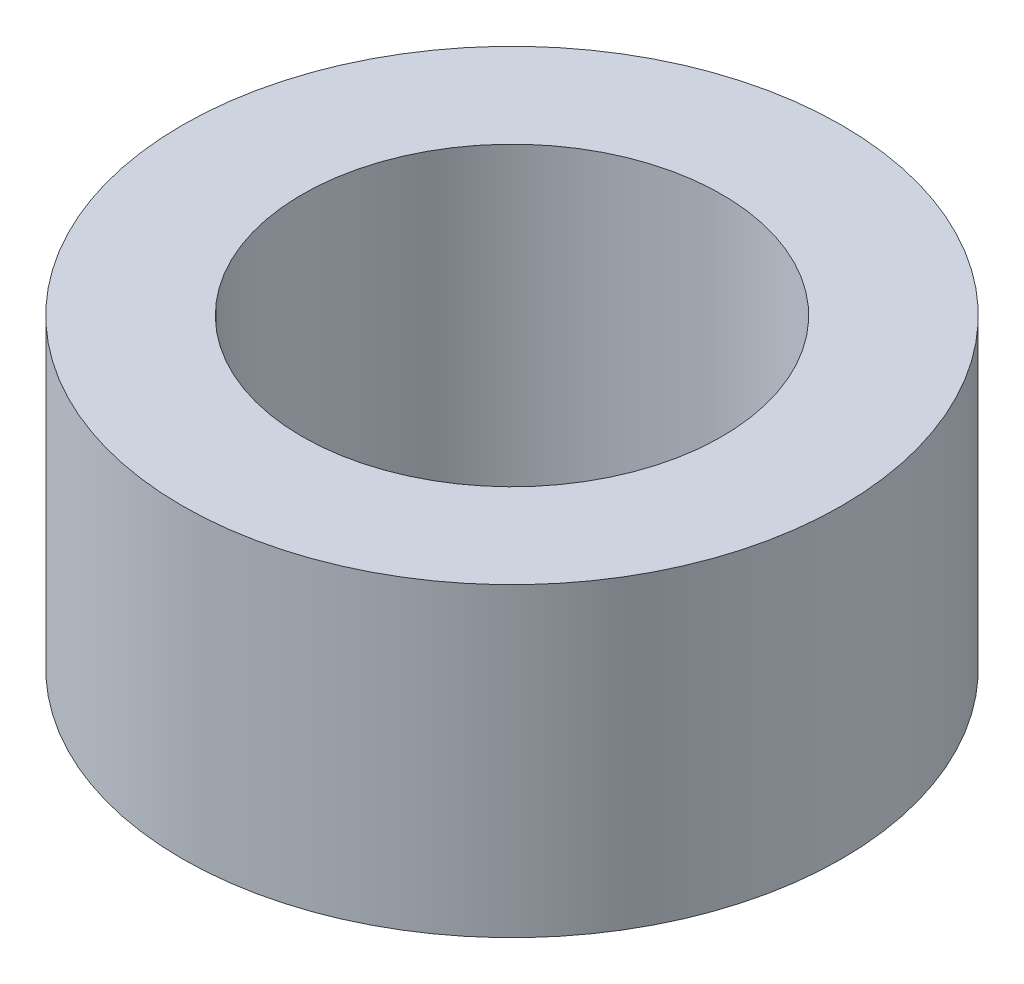
ISO-10303-21;
HEADER;
FILE_DESCRIPTION(('STEP AP214'),'2;1');
FILE_NAME('part.step','',(''),(''),'','','');
FILE_SCHEMA(('AUTOMOTIVE_DESIGN { 1 0 10303 214 1 1 1 1 }'));
ENDSEC;
DATA;
#1=APPLICATION_CONTEXT('core data for automotive mechanical design processes');
#2=APPLICATION_PROTOCOL_DEFINITION('international standard','automotive_design',2000,#1);
#3=PRODUCT_CONTEXT('',#1,'mechanical');
#4=PRODUCT('Part','Part','',(#3));
#5=PRODUCT_RELATED_PRODUCT_CATEGORY('part','',(#4));
#6=PRODUCT_DEFINITION_FORMATION('','',#4);
#7=PRODUCT_DEFINITION_CONTEXT('part definition',#1,'design');
#8=PRODUCT_DEFINITION('design','',#6,#7);
#9=PRODUCT_DEFINITION_SHAPE('','',#8);
#10=(LENGTH_UNIT() NAMED_UNIT(*) SI_UNIT(.MILLI.,.METRE.));
#11=(NAMED_UNIT(*) PLANE_ANGLE_UNIT() SI_UNIT($,.RADIAN.));
#12=(NAMED_UNIT(*) SI_UNIT($,.STERADIAN.) SOLID_ANGLE_UNIT());
#13=UNCERTAINTY_MEASURE_WITH_UNIT(LENGTH_MEASURE(1.E-05),#10,'distance_accuracy_value','');
#14=(GEOMETRIC_REPRESENTATION_CONTEXT(3) GLOBAL_UNCERTAINTY_ASSIGNED_CONTEXT((#13)) GLOBAL_UNIT_ASSIGNED_CONTEXT((#10,
#11,#12)) REPRESENTATION_CONTEXT('',''));
#15=CARTESIAN_POINT('',(0.,0.,0.));
#16=DIRECTION('',(0.,0.,1.));
#17=DIRECTION('',(1.,0.,0.));
#18=AXIS2_PLACEMENT_3D('',#15,#16,#17);
#19=CARTESIAN_POINT('',(0.,5.1,0.));
#20=DIRECTION('',(0.,1.,0.));
#21=DIRECTION('',(0.,0.,1.));
#22=AXIS2_PLACEMENT_3D('',#19,#20,#21);
#23=PLANE('',#22);
#24=CARTESIAN_POINT('',(0.,5.1,0.));
#25=DIRECTION('',(0.,1.,0.));
#26=DIRECTION('',(0.,0.,1.));
#27=AXIS2_PLACEMENT_3D('',#24,#25,#26);
#28=CIRCLE('',#27,5.5);
#29=CARTESIAN_POINT('',(0.,5.1,5.5));
#30=VERTEX_POINT('',#29);
#31=EDGE_CURVE('E10',#30,#30,#28,.T.);
#32=ORIENTED_EDGE('',*,*,#31,.T.);
#33=EDGE_LOOP('',(#32));
#34=FACE_BOUND('',#33,.T.);
#35=CARTESIAN_POINT('',(0.,5.1,0.));
#36=DIRECTION('',(0.,1.,0.));
#37=DIRECTION('',(0.,0.,1.));
#38=AXIS2_PLACEMENT_3D('',#35,#36,#37);
#39=CIRCLE('',#38,3.5);
#40=CARTESIAN_POINT('',(0.,5.1,3.5));
#41=VERTEX_POINT('',#40);
#42=EDGE_CURVE('E60',#41,#41,#39,.T.);
#43=ORIENTED_EDGE('',*,*,#42,.F.);
#44=EDGE_LOOP('',(#43));
#45=FACE_BOUND('',#44,.T.);
#46=ADVANCED_FACE('F45',(#34,#45),#23,.T.);
#47=CARTESIAN_POINT('',(0.,0.,0.));
#48=DIRECTION('',(0.,1.,0.));
#49=DIRECTION('',(0.,0.,1.));
#50=AXIS2_PLACEMENT_3D('',#47,#48,#49);
#51=PLANE('',#50);
#52=CARTESIAN_POINT('',(0.,0.,0.));
#53=DIRECTION('',(0.,1.,0.));
#54=DIRECTION('',(0.,0.,1.));
#55=AXIS2_PLACEMENT_3D('',#52,#53,#54);
#56=CIRCLE('',#55,5.5);
#57=CARTESIAN_POINT('',(0.,0.,5.5));
#58=VERTEX_POINT('',#57);
#59=EDGE_CURVE('E49',#58,#58,#56,.T.);
#60=ORIENTED_EDGE('',*,*,#59,.F.);
#61=EDGE_LOOP('',(#60));
#62=FACE_BOUND('',#61,.T.);
#63=CARTESIAN_POINT('',(0.,0.,0.));
#64=DIRECTION('',(0.,1.,0.));
#65=DIRECTION('',(0.,0.,1.));
#66=AXIS2_PLACEMENT_3D('',#63,#64,#65);
#67=CIRCLE('',#66,3.5);
#68=CARTESIAN_POINT('',(0.,0.,3.5));
#69=VERTEX_POINT('',#68);
#70=EDGE_CURVE('E62',#69,#69,#67,.T.);
#71=ORIENTED_EDGE('',*,*,#70,.T.);
#72=EDGE_LOOP('',(#71));
#73=FACE_BOUND('',#72,.T.);
#74=ADVANCED_FACE('F74',(#62,#73),#51,.F.);
#75=CARTESIAN_POINT('',(0.,5.1,0.));
#76=DIRECTION('',(0.,-1.,0.));
#77=DIRECTION('',(0.,0.,-1.));
#78=AXIS2_PLACEMENT_3D('',#75,#76,#77);
#79=CYLINDRICAL_SURFACE('',#78,5.5);
#80=ORIENTED_EDGE('',*,*,#31,.F.);
#81=EDGE_LOOP('',(#80));
#82=FACE_BOUND('',#81,.T.);
#83=ORIENTED_EDGE('',*,*,#59,.T.);
#84=EDGE_LOOP('',(#83));
#85=FACE_BOUND('',#84,.T.);
#86=ADVANCED_FACE('F47',(#82,#85),#79,.T.);
#87=CARTESIAN_POINT('',(0.,5.1,0.));
#88=DIRECTION('',(0.,-1.,0.));
#89=DIRECTION('',(0.,0.,-1.));
#90=AXIS2_PLACEMENT_3D('',#87,#88,#89);
#91=CYLINDRICAL_SURFACE('',#90,3.5);
#92=ORIENTED_EDGE('',*,*,#42,.T.);
#93=EDGE_LOOP('',(#92));
#94=FACE_BOUND('',#93,.T.);
#95=ORIENTED_EDGE('',*,*,#70,.F.);
#96=EDGE_LOOP('',(#95));
#97=FACE_BOUND('',#96,.T.);
#98=ADVANCED_FACE('F70',(#94,#97),#91,.F.);
#99=CLOSED_SHELL('',(#46,#74,#86,#98));
#100=MANIFOLD_SOLID_BREP('B2',#99);
#101=ADVANCED_BREP_SHAPE_REPRESENTATION('',(#18,#100),#14);
#102=SHAPE_DEFINITION_REPRESENTATION(#9,#101);
ENDSEC;
END-ISO-10303-21;
